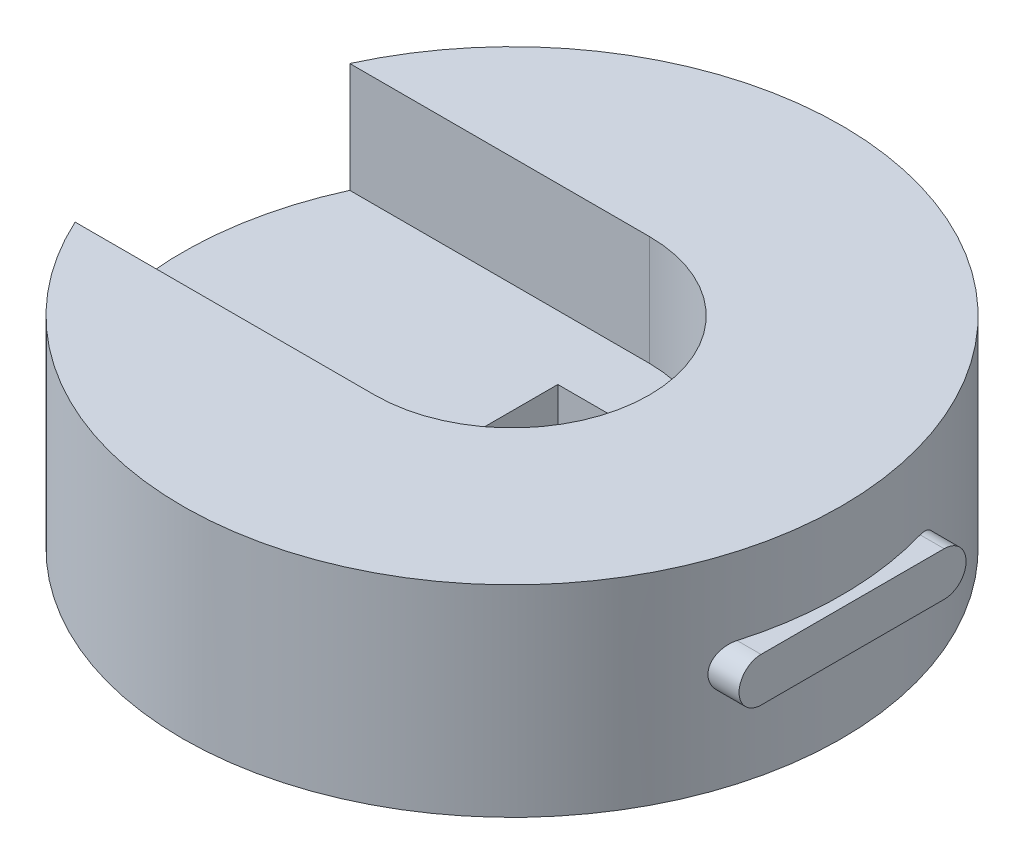
ISO-10303-21;
HEADER;
FILE_DESCRIPTION(('STEP AP214'),'2;1');
FILE_NAME('part.step','',(''),(''),'','','');
FILE_SCHEMA(('AUTOMOTIVE_DESIGN { 1 0 10303 214 1 1 1 1 }'));
ENDSEC;
DATA;
#1=APPLICATION_CONTEXT('core data for automotive mechanical design processes');
#2=APPLICATION_PROTOCOL_DEFINITION('international standard','automotive_design',2000,#1);
#3=PRODUCT_CONTEXT('',#1,'mechanical');
#4=PRODUCT('Part','Part','',(#3));
#5=PRODUCT_RELATED_PRODUCT_CATEGORY('part','',(#4));
#6=PRODUCT_DEFINITION_FORMATION('','',#4);
#7=PRODUCT_DEFINITION_CONTEXT('part definition',#1,'design');
#8=PRODUCT_DEFINITION('design','',#6,#7);
#9=PRODUCT_DEFINITION_SHAPE('','',#8);
#10=(LENGTH_UNIT() NAMED_UNIT(*) SI_UNIT(.MILLI.,.METRE.));
#11=(NAMED_UNIT(*) PLANE_ANGLE_UNIT() SI_UNIT($,.RADIAN.));
#12=(NAMED_UNIT(*) SI_UNIT($,.STERADIAN.) SOLID_ANGLE_UNIT());
#13=UNCERTAINTY_MEASURE_WITH_UNIT(LENGTH_MEASURE(1.E-05),#10,'distance_accuracy_value','');
#14=(GEOMETRIC_REPRESENTATION_CONTEXT(3) GLOBAL_UNCERTAINTY_ASSIGNED_CONTEXT((#13)) GLOBAL_UNIT_ASSIGNED_CONTEXT((#10,
#11,#12)) REPRESENTATION_CONTEXT('',''));
#15=CARTESIAN_POINT('',(0.,0.,0.));
#16=DIRECTION('',(0.,0.,1.));
#17=DIRECTION('',(1.,0.,0.));
#18=AXIS2_PLACEMENT_3D('',#15,#16,#17);
#19=CARTESIAN_POINT('',(0.,55.,0.));
#20=DIRECTION('',(0.,-1.,0.));
#21=DIRECTION('',(0.,0.,-1.));
#22=AXIS2_PLACEMENT_3D('',#19,#20,#21);
#23=CYLINDRICAL_SURFACE('',#22,90.);
#24=CARTESIAN_POINT('',(0.,0.,0.));
#25=DIRECTION('',(0.,1.,0.));
#26=DIRECTION('',(0.,0.,1.));
#27=AXIS2_PLACEMENT_3D('',#24,#25,#26);
#28=CIRCLE('',#27,90.);
#29=CARTESIAN_POINT('',(0.,0.,90.));
#30=VERTEX_POINT('',#29);
#31=EDGE_CURVE('E227',#30,#30,#28,.T.);
#32=ORIENTED_EDGE('',*,*,#31,.T.);
#33=EDGE_LOOP('',(#32));
#34=FACE_BOUND('',#33,.T.);
#35=CARTESIAN_POINT('',(0.,25.,0.));
#36=DIRECTION('',(0.,1.,0.));
#37=DIRECTION('',(0.,0.,1.));
#38=AXIS2_PLACEMENT_3D('',#35,#36,#37);
#39=CIRCLE('',#38,90.);
#40=CARTESIAN_POINT('',(-81.8153408597679,25.,-37.5));
#41=VERTEX_POINT('',#40);
#42=CARTESIAN_POINT('',(-81.8153408597679,25.,37.5));
#43=VERTEX_POINT('',#42);
#44=EDGE_CURVE('E235',#41,#43,#39,.T.);
#45=ORIENTED_EDGE('',*,*,#44,.F.);
#46=DIRECTION('',(0.,-1.,0.));
#47=VECTOR('',#46,1.);
#48=CARTESIAN_POINT('',(-81.8153408597679,55.,-37.5));
#49=LINE('',#48,#47);
#50=CARTESIAN_POINT('',(-81.8153408597679,55.,-37.5));
#51=VERTEX_POINT('',#50);
#52=EDGE_CURVE('E224',#41,#51,#49,.F.);
#53=ORIENTED_EDGE('',*,*,#52,.T.);
#54=CARTESIAN_POINT('',(0.,55.,0.));
#55=DIRECTION('',(0.,1.,0.));
#56=DIRECTION('',(0.,0.,1.));
#57=AXIS2_PLACEMENT_3D('',#54,#55,#56);
#58=CIRCLE('',#57,90.);
#59=CARTESIAN_POINT('',(-81.8153408597679,55.,37.5));
#60=VERTEX_POINT('',#59);
#61=EDGE_CURVE('E228',#60,#51,#58,.T.);
#62=ORIENTED_EDGE('',*,*,#61,.F.);
#63=DIRECTION('',(0.,-1.,0.));
#64=VECTOR('',#63,1.);
#65=CARTESIAN_POINT('',(-81.8153408597679,55.,37.5));
#66=LINE('',#65,#64);
#67=EDGE_CURVE('E219',#60,#43,#66,.T.);
#68=ORIENTED_EDGE('',*,*,#67,.T.);
#69=EDGE_LOOP('',(#45,#53,#62,#68));
#70=FACE_BOUND('',#69,.T.);
#71=CARTESIAN_POINT('',(84.4936888374006,27.920844977807,30.9970409337492));
#72=CARTESIAN_POINT('',(84.4936881424236,27.7595321566228,30.997042424593));
#73=CARTESIAN_POINT('',(84.4960789077135,27.5982394717825,30.990528150367));
#74=CARTESIAN_POINT('',(84.5056074251636,27.2767898667361,30.9645363452115));
#75=CARTESIAN_POINT('',(84.5127464567855,27.1166332644164,30.9450553202777));
#76=CARTESIAN_POINT('',(84.5316809137933,26.7985415261515,30.8932950373056));
#77=CARTESIAN_POINT('',(84.5434804123276,26.6406084589095,30.8610045839935));
#78=CARTESIAN_POINT('',(84.5715771635561,26.3281695900462,30.7839246568537));
#79=CARTESIAN_POINT('',(84.587876122609,26.1736651127347,30.7391304410735));
#80=CARTESIAN_POINT('',(84.6247075891661,25.8695662987199,30.6375875684278));
#81=CARTESIAN_POINT('',(84.6452301141676,25.7199613311639,30.5808670928401));
#82=CARTESIAN_POINT('',(84.690276248355,25.4262105573962,30.4558946573537));
#83=CARTESIAN_POINT('',(84.7148013347413,25.2820667910085,30.3876384396986));
#84=CARTESIAN_POINT('',(84.76753287702,25.0002689272316,30.2402296586008));
#85=CARTESIAN_POINT('',(84.7957374079603,24.8626114873356,30.161082791574));
#86=CARTESIAN_POINT('',(84.8555204239438,24.5944696247351,29.9924766713173));
#87=CARTESIAN_POINT('',(84.8871001868316,24.4639879472523,29.9030135113766));
#88=CARTESIAN_POINT('',(84.9542275474404,24.2073604370261,29.7117782844163));
#89=CARTESIAN_POINT('',(84.9898626783813,24.0814447065546,29.6097277454285));
#90=CARTESIAN_POINT('',(85.0639431195945,23.8387105424476,29.3962307134208));
#91=CARTESIAN_POINT('',(85.1023894499013,23.7218954430198,29.2847808075983));
#92=CARTESIAN_POINT('',(85.2213476080713,23.3861202975684,28.9375460831227));
#93=CARTESIAN_POINT('',(85.3055294181435,23.1816384988439,28.6887324508929));
#94=CARTESIAN_POINT('',(85.4853164839053,22.8056799190263,28.1486424797082));
#95=CARTESIAN_POINT('',(85.5812974811083,22.6366933107123,27.8557683424992));
#96=CARTESIAN_POINT('',(85.7770982847613,22.3504523025249,27.2468649932208));
#97=CARTESIAN_POINT('',(85.8769189931699,22.2332101392404,26.9308303247025));
#98=CARTESIAN_POINT('',(86.0810848695186,22.0496809019785,26.2710970132447));
#99=CARTESIAN_POINT('',(86.1854543028129,21.9855660378699,25.9267998352406));
#100=CARTESIAN_POINT('',(86.391568226238,21.9181027586716,25.2314966083225));
#101=CARTESIAN_POINT('',(86.4933125441087,21.9147583212625,24.8804901217613));
#102=CARTESIAN_POINT('',(86.6917916024304,21.9697122878373,24.1798778450227));
#103=CARTESIAN_POINT('',(86.7884977971193,22.0283287290577,23.830288617703));
#104=CARTESIAN_POINT('',(86.9737905922999,22.2069648041048,23.1448870996679));
#105=CARTESIAN_POINT('',(87.0623780915996,22.3269776311273,22.8090732861773));
#106=CARTESIAN_POINT('',(87.2274013806671,22.6223559042148,22.1695085614334));
#107=CARTESIAN_POINT('',(87.3040724754846,22.7963644782543,21.8651923556667));
#108=CARTESIAN_POINT('',(87.4461641438947,23.1962596314542,21.2898166412541));
#109=CARTESIAN_POINT('',(87.5115868125453,23.4221365316163,21.0187509422879));
#110=CARTESIAN_POINT('',(87.6281305936377,23.9113271073308,20.5273613355225));
#111=CARTESIAN_POINT('',(87.6796519510628,24.1731618056236,20.3056596564914));
#112=CARTESIAN_POINT('',(87.7704871837005,24.7322199350791,19.9093708387509));
#113=CARTESIAN_POINT('',(87.8098029905419,25.0294377562606,19.7347762455306));
#114=CARTESIAN_POINT('',(87.8749380928915,25.6421199797018,19.4426631933344));
#115=CARTESIAN_POINT('',(87.9010929574874,25.9568755815819,19.3237316934144));
#116=CARTESIAN_POINT('',(87.9412763589122,26.602549530093,19.1400324670744));
#117=CARTESIAN_POINT('',(87.9553060911713,26.9334662799789,19.0752594011346));
#118=CARTESIAN_POINT('',(87.9710347267168,27.5966031838741,19.0025898864508));
#119=CARTESIAN_POINT('',(87.9729199199429,27.9287250531896,18.993834179485));
#120=CARTESIAN_POINT('',(87.9648458547614,28.5897135721175,19.0311914538052));
#121=CARTESIAN_POINT('',(87.9548870942236,28.9185803579738,19.0773021287404));
#122=CARTESIAN_POINT('',(87.9232445741436,29.5623902693515,19.2226038957713));
#123=CARTESIAN_POINT('',(87.9016075443399,29.877383512078,19.3215834207831));
#124=CARTESIAN_POINT('',(87.8467837472389,30.4860474231013,19.5693275815515));
#125=CARTESIAN_POINT('',(87.813596876973,30.7797179012739,19.7180926611543));
#126=CARTESIAN_POINT('',(87.735692968886,31.3396469882693,20.0618876611278));
#127=CARTESIAN_POINT('',(87.6908998117291,31.605707744866,20.2572223034692));
#128=CARTESIAN_POINT('',(87.5903761802518,32.1011478671347,20.6875488732266));
#129=CARTESIAN_POINT('',(87.5346449858582,32.3305248160321,20.9225434113911));
#130=CARTESIAN_POINT('',(87.4119167720311,32.7506290055154,21.4295586399996));
#131=CARTESIAN_POINT('',(87.3447368456103,32.9405954381751,21.7021640427162));
#132=CARTESIAN_POINT('',(87.2008712402887,33.2722803205098,22.2731778876004));
#133=CARTESIAN_POINT('',(87.124184370874,33.4139927191962,22.571589559959));
#134=CARTESIAN_POINT('',(87.0020824766936,33.5897424030568,23.0361562930428));
#135=CARTESIAN_POINT('',(86.9595580246394,33.6426548500053,23.1961935608908));
#136=CARTESIAN_POINT('',(86.8726283662795,33.7347354348725,23.5196600072679));
#137=CARTESIAN_POINT('',(86.8282237636076,33.7739079471409,23.6830880886898));
#138=CARTESIAN_POINT('',(86.7377629223392,33.8383672885211,24.0122813486444));
#139=CARTESIAN_POINT('',(86.6917059113791,33.8636475316466,24.1780475975172));
#140=CARTESIAN_POINT('',(86.5982472822948,33.9002302505334,24.5106792511163));
#141=CARTESIAN_POINT('',(86.5508461085486,33.9115372919519,24.6775442788983));
#142=CARTESIAN_POINT('',(86.4534219257235,33.920339304515,25.0167539210096));
#143=CARTESIAN_POINT('',(86.4033637655607,33.9173737236003,25.1891004751637));
#144=CARTESIAN_POINT('',(86.302478304608,33.896664830867,25.5326119844518));
#145=CARTESIAN_POINT('',(86.2516512620505,33.8789263769457,25.7037773093665));
#146=CARTESIAN_POINT('',(86.1495557033866,33.8288313961305,26.0439167152924));
#147=CARTESIAN_POINT('',(86.098286979569,33.7964675765497,26.2128896598181));
#148=CARTESIAN_POINT('',(85.9957439173726,33.7173683271077,26.5473655484759));
#149=CARTESIAN_POINT('',(85.9444695874333,33.6706379981262,26.7128697019716));
#150=CARTESIAN_POINT('',(85.8411943202397,33.5619256833007,27.0429270986575));
#151=CARTESIAN_POINT('',(85.7892019206462,33.4996333311396,27.2073809032161));
#152=CARTESIAN_POINT('',(85.6861037688453,33.3607623140771,27.5303532360127));
#153=CARTESIAN_POINT('',(85.6349976970804,33.2841889202499,27.6888739283015));
#154=CARTESIAN_POINT('',(85.5341128049979,33.1171633022435,27.9989668446863));
#155=CARTESIAN_POINT('',(85.4843345526968,33.0267052467787,28.1505361144223));
#156=CARTESIAN_POINT('',(85.3866488074958,32.8325095387744,28.4454623794897));
#157=CARTESIAN_POINT('',(85.3387405531351,32.7287773666354,28.5888227288266));
#158=CARTESIAN_POINT('',(85.2456526072982,32.5094830303802,28.8652007274153));
#159=CARTESIAN_POINT('',(85.2004545946597,32.3940191332198,28.9982901358573));
#160=CARTESIAN_POINT('',(85.1129180579539,32.1513512993236,29.2542213610126));
#161=CARTESIAN_POINT('',(85.070578391885,32.0241520998685,29.3770672750004));
#162=CARTESIAN_POINT('',(84.9892434434781,31.758743989807,29.6115502484595));
#163=CARTESIAN_POINT('',(84.9502491475311,31.6205318550198,29.7231840036421));
#164=CARTESIAN_POINT('',(84.8761317924061,31.3340647235035,29.9341737726111));
#165=CARTESIAN_POINT('',(84.8410084858445,31.1858103695218,30.0335305710311));
#166=CARTESIAN_POINT('',(84.7765553184866,30.8869512530778,30.2149720400923));
#167=CARTESIAN_POINT('',(84.7470401489304,30.7367279110807,30.297619271329));
#168=CARTESIAN_POINT('',(84.692406681201,30.4291119094277,30.4500050271356));
#169=CARTESIAN_POINT('',(84.6672880325461,30.2717198225113,30.5197445807049));
#170=CARTESIAN_POINT('',(84.6218427724895,29.9511523054969,30.6455249050695));
#171=CARTESIAN_POINT('',(84.6015091180507,29.7879857872369,30.7015858140131));
#172=CARTESIAN_POINT('',(84.5659006141775,29.4569805818044,30.7995319359595));
#173=CARTESIAN_POINT('',(84.5506239947134,29.2891435517185,30.8414221090213));
#174=CARTESIAN_POINT('',(84.5233340387093,28.9228725266971,30.9161422557061));
#175=CARTESIAN_POINT('',(84.5122368458254,28.7238479878853,30.9464421153079));
#176=CARTESIAN_POINT('',(84.4974147934421,28.3234867911413,30.9868902107625));
#177=CARTESIAN_POINT('',(84.4936897046752,28.1221502053082,30.9970390732978));
#178=CARTESIAN_POINT('',(84.4936888374006,27.920844977807,30.9970409337492));
#179=B_SPLINE_CURVE_WITH_KNOTS('',3,(#71,#72,#73,#74,#75,#76,#77,#78,#79,#80,#81,#82,#83,#84,
#85,#86,#87,#88,#89,#90,#91,#92,#93,#94,#95,#96,#97,#98,#99,#100,#101,#102,#103,#104,#105,#106,
#107,#108,#109,#110,#111,#112,#113,#114,#115,#116,#117,#118,#119,#120,#121,#122,#123,#124,#125,
#126,#127,#128,#129,#130,#131,#132,#133,#134,#135,#136,#137,#138,#139,#140,#141,#142,#143,#144,
#145,#146,#147,#148,#149,#150,#151,#152,#153,#154,#155,#156,#157,#158,#159,#160,#161,#162,#163,
#164,#165,#166,#167,#168,#169,#170,#171,#172,#173,#174,#175,#176,#177,#178),.UNSPECIFIED.,.T.,
.F.,(4,2,2,2,2,2,2,2,2,2,2,2,2,2,2,2,2,2,2,2,2,2,2,2,2,2,2,2,2,2,2,2,2,2,2,2,2,2,2,2,2,2,2,2,2,
2,2,2,2,2,2,2,2,4),(0.,0.483755046793423,0.967640498410447,1.45194979466571,1.93644301149584,
2.41980400343523,2.90334379150209,3.38663161600419,3.87010306314834,4.36737589570313,
4.86483006612829,5.85901141809894,6.90887825064133,7.95899322410503,9.05017860704806,
10.1414354124167,11.2383208227565,12.3350846515646,13.4062578534235,14.4772313289557,
15.5129121266728,16.5484289357263,17.5560027683374,18.5634772517861,19.5554601266868,
20.5474013042944,21.5354024138058,22.5234123317392,23.5180737348951,24.5128006406048,
25.5252372404767,26.5378007517718,27.058830982119,27.5796951824481,28.1008060992404,
28.6217467012021,29.1596077278379,29.6972919545753,30.2352445846407,30.7730064328947,
31.3224950837276,31.8717813204829,32.4212988810962,32.970590293474,33.515610225817,
34.0604111004358,34.6053720628221,35.1502981781311,35.6715685294557,36.1927973072229,
36.7132540209687,37.2335283748401,37.8372339433392,38.4409207367057),.UNSPECIFIED.);
#180=CARTESIAN_POINT('',(86.4580823289529,33.9178859115562,25.));
#181=VERTEX_POINT('',#180);
#182=CARTESIAN_POINT('',(86.4580823289529,21.9238040440579,25.));
#183=VERTEX_POINT('',#182);
#184=EDGE_CURVE('E12',#181,#183,#179,.T.);
#185=ORIENTED_EDGE('',*,*,#184,.F.);
#186=CARTESIAN_POINT('',(0.,33.9178859115562,0.));
#187=DIRECTION('',(0.,-1.,0.));
#188=DIRECTION('',(0.,0.,-1.));
#189=AXIS2_PLACEMENT_3D('',#186,#187,#188);
#190=CIRCLE('',#189,90.);
#191=CARTESIAN_POINT('',(86.4580823289529,33.9178859115562,-25.));
#192=VERTEX_POINT('',#191);
#193=EDGE_CURVE('E237',#192,#181,#190,.T.);
#194=ORIENTED_EDGE('',*,*,#193,.F.);
#195=CARTESIAN_POINT('',(87.9709471742029,27.920844977807,-19.0029590662509));
#196=CARTESIAN_POINT('',(87.9709473171616,27.7554213502532,-19.0029577049029));
#197=CARTESIAN_POINT('',(87.9694687255625,27.5900183356423,-19.0098069781072));
#198=CARTESIAN_POINT('',(87.9635559148134,27.2603428641632,-19.0371487594419));
#199=CARTESIAN_POINT('',(87.9591209263098,27.096070712829,-19.0576448189217));
#200=CARTESIAN_POINT('',(87.9472954643351,26.7697471661893,-19.1121426129698));
#201=CARTESIAN_POINT('',(87.9399024373494,26.607697815038,-19.1461560161584));
#202=CARTESIAN_POINT('',(87.9221688347065,26.2870560486114,-19.2274271877194));
#203=CARTESIAN_POINT('',(87.9118271745925,26.1284649283577,-19.274689828827));
#204=CARTESIAN_POINT('',(87.8882288686284,25.816110949248,-19.3820081058385));
#205=CARTESIAN_POINT('',(87.8749757411725,25.6623425164999,-19.4420482978591));
#206=CARTESIAN_POINT('',(87.8455666720555,25.3604502963985,-19.5744991404068));
#207=CARTESIAN_POINT('',(87.8294096641704,25.2123286066671,-19.6469143342079));
#208=CARTESIAN_POINT('',(87.7942409224265,24.9228956270012,-19.8034767243037));
#209=CARTESIAN_POINT('',(87.7752309362567,24.7815802371607,-19.8876167359222));
#210=CARTESIAN_POINT('',(87.7343865857253,24.5065634620269,-20.0670345238309));
#211=CARTESIAN_POINT('',(87.7125511726608,24.3728649305253,-20.1623164343463));
#212=CARTESIAN_POINT('',(87.66594706573,24.1130566355552,-20.3640004001537));
#213=CARTESIAN_POINT('',(87.6411577977407,23.9870105833825,-20.4704797632942));
#214=CARTESIAN_POINT('',(87.5888425723637,23.7443705398799,-20.6931810347258));
#215=CARTESIAN_POINT('',(87.5613156167575,23.6277800245756,-20.8094064942077));
#216=CARTESIAN_POINT('',(87.5036318540475,23.4048641277244,-21.050648058659));
#217=CARTESIAN_POINT('',(87.4734757738119,23.2985359259993,-21.1756617321308));
#218=CARTESIAN_POINT('',(87.4106263956904,23.0967118832293,-21.4336190453324));
#219=CARTESIAN_POINT('',(87.3779321517969,23.0012201140286,-21.5665656374542));
#220=CARTESIAN_POINT('',(87.3094247847416,22.819760652017,-21.8422737200931));
#221=CARTESIAN_POINT('',(87.2735603524619,22.7340368723396,-21.9851832525168));
#222=CARTESIAN_POINT('',(87.1994849731229,22.5749668353921,-22.2771760933702));
#223=CARTESIAN_POINT('',(87.1612731551025,22.5016252106238,-22.4262616865686));
#224=CARTESIAN_POINT('',(87.0434041241263,22.3008561153209,-22.8810720926354));
#225=CARTESIAN_POINT('',(86.960451175049,22.1925197824128,-23.1946020634339));
#226=CARTESIAN_POINT('',(86.784911560591,22.0266437704688,-23.8431383251133));
#227=CARTESIAN_POINT('',(86.6921080757283,21.9707561552085,-24.1785080634547));
#228=CARTESIAN_POINT('',(86.5491065799133,21.9297602395526,-24.683660574111));
#229=CARTESIAN_POINT('',(86.5007773366151,21.9232429260237,-24.8524937130109));
#230=CARTESIAN_POINT('',(86.4031496338098,21.9244397605634,-25.1898087746536));
#231=CARTESIAN_POINT('',(86.3538515073327,21.9321491003696,-25.3582907967987));
#232=CARTESIAN_POINT('',(86.2530788962965,21.9621499203634,-25.6990065016467));
#233=CARTESIAN_POINT('',(86.2015842780357,21.984885361721,-25.871194895296));
#234=CARTESIAN_POINT('',(86.0983178425036,22.045161316552,-26.2128115679143));
#235=CARTESIAN_POINT('',(86.0465461250198,22.0826968132797,-26.3822407619202));
#236=CARTESIAN_POINT('',(85.9430924143885,22.1723339407939,-26.7173283050506));
#237=CARTESIAN_POINT('',(85.8914104790848,22.2244428492252,-26.8829847253208));
#238=CARTESIAN_POINT('',(85.7886133820729,22.342866906742,-27.2092458354056));
#239=CARTESIAN_POINT('',(85.7374980173178,22.4091767811703,-27.3698523755624));
#240=CARTESIAN_POINT('',(85.6355625521514,22.5566372568278,-27.687155501401));
#241=CARTESIAN_POINT('',(85.5847564105533,22.6379811705935,-27.8437668121729));
#242=CARTESIAN_POINT('',(85.4846814464159,22.8143588586624,-28.1495134212817));
#243=CARTESIAN_POINT('',(85.4354120353996,22.9093873123071,-28.2986515949949));
#244=CARTESIAN_POINT('',(85.3388782657479,23.1126336698886,-28.5884451156253));
#245=CARTESIAN_POINT('',(85.2916147231049,23.2208568734484,-28.7290970199336));
#246=CARTESIAN_POINT('',(85.1996560462961,23.4497577634383,-29.0006751209361));
#247=CARTESIAN_POINT('',(85.1549598076498,23.5704300307249,-29.1316055071306));
#248=CARTESIAN_POINT('',(85.0695152393431,23.8209547721477,-29.380171956094));
#249=CARTESIAN_POINT('',(85.0287054737648,23.9505730519696,-29.4980228629226));
#250=CARTESIAN_POINT('',(84.9505550897128,24.2201997029248,-29.7223366285078));
#251=CARTESIAN_POINT('',(84.9132130204934,24.360203684596,-29.8288042524223));
#252=CARTESIAN_POINT('',(84.8424703502575,24.6497033772312,-30.0294279591511));
#253=CARTESIAN_POINT('',(84.8090695480034,24.7991986029807,-30.1235846705762));
#254=CARTESIAN_POINT('',(84.7466764314343,25.1066188587815,-30.2986712071819));
#255=CARTESIAN_POINT('',(84.7176838894891,25.2645434529946,-30.3796017153425));
#256=CARTESIAN_POINT('',(84.6659308168102,25.5791598482977,-30.5235269861506));
#257=CARTESIAN_POINT('',(84.6429234504208,25.7354831767266,-30.5872390251716));
#258=CARTESIAN_POINT('',(84.6015799494049,26.053493823188,-30.7014064889492));
#259=CARTESIAN_POINT('',(84.5832435255855,26.2151808084384,-30.7518627344207));
#260=CARTESIAN_POINT('',(84.551516468408,26.5426533992405,-30.8389885532717));
#261=CARTESIAN_POINT('',(84.5381243930019,26.7084377946842,-30.8756621464986));
#262=CARTESIAN_POINT('',(84.5164838745364,27.0428453951438,-30.9348500946392));
#263=CARTESIAN_POINT('',(84.5082352392954,27.2114684938516,-30.9573649785848));
#264=CARTESIAN_POINT('',(84.4973061968568,27.5412471936995,-30.987182521607));
#265=CARTESIAN_POINT('',(84.4943549644929,27.7023273834971,-30.9952251226036));
#266=CARTESIAN_POINT('',(84.4932238335453,28.0246851874477,-30.9983085077877));
#267=CARTESIAN_POINT('',(84.4950455201582,28.1859628494057,-30.9933449723369));
#268=CARTESIAN_POINT('',(84.5034357641916,28.5073915501854,-30.9704615926406));
#269=CARTESIAN_POINT('',(84.5100020232992,28.6675430965944,-30.9525480215049));
#270=CARTESIAN_POINT('',(84.5277893726936,28.9856924609016,-30.9039397543902));
#271=CARTESIAN_POINT('',(84.5390121896041,29.1436894574371,-30.8732403174731));
#272=CARTESIAN_POINT('',(84.5657403480518,29.4538277720127,-30.7999521545553));
#273=CARTESIAN_POINT('',(84.5811739759091,29.606022388096,-30.7575624042977));
#274=CARTESIAN_POINT('',(84.6162022001121,29.9062164248875,-30.6610658378926));
#275=CARTESIAN_POINT('',(84.6357982840816,30.0542143242357,-30.6069548325384));
#276=CARTESIAN_POINT('',(84.6788960336934,30.3449673725628,-30.4875153610087));
#277=CARTESIAN_POINT('',(84.7023965448377,30.4877240561237,-30.4221902105485));
#278=CARTESIAN_POINT('',(84.7530351510193,30.7672234351908,-30.2808300501559));
#279=CARTESIAN_POINT('',(84.780174617828,30.9039638368049,-30.2047910008701));
#280=CARTESIAN_POINT('',(84.8386364722139,31.1745668714411,-30.0401999178861));
#281=CARTESIAN_POINT('',(84.8700595387294,31.3082217615865,-29.9513421221501));
#282=CARTESIAN_POINT('',(84.9360834270774,31.5675268384423,-29.7635958002596));
#283=CARTESIAN_POINT('',(84.9706854087693,31.6931740749327,-29.6647036115695));
#284=CARTESIAN_POINT('',(85.0426813372741,31.9357033905963,-29.4576705602709));
#285=CARTESIAN_POINT('',(85.080074812532,32.0525869435245,-29.3495312592905));
#286=CARTESIAN_POINT('',(85.1572956575386,32.277042592971,-29.1247168798941));
#287=CARTESIAN_POINT('',(85.1971239395307,32.3846111625365,-29.0080385989307));
#288=CARTESIAN_POINT('',(85.281055634699,32.5954443398936,-28.7603812667974));
#289=CARTESIAN_POINT('',(85.3252737492546,32.6981566073492,-28.6289695597488));
#290=CARTESIAN_POINT('',(85.4155514442783,32.8920409667703,-28.3584905722184));
#291=CARTESIAN_POINT('',(85.461611669676,32.9832089696759,-28.2194206040148));
#292=CARTESIAN_POINT('',(85.6019385592734,33.2386341539236,-27.7920397925397));
#293=CARTESIAN_POINT('',(85.6984169032377,33.3849754265609,-27.4933658902189));
#294=CARTESIAN_POINT('',(85.847120603247,33.5686555491053,-27.0240782250407));
#295=CARTESIAN_POINT('',(85.898547798126,33.6247202806997,-26.8601897162528));
#296=CARTESIAN_POINT('',(86.0016412992161,33.7224687230444,-26.5282452519832));
#297=CARTESIAN_POINT('',(86.0533075275025,33.7641568260154,-26.3601905861575));
#298=CARTESIAN_POINT('',(86.1564829753157,33.8328714915229,-26.0209897652777));
#299=CARTESIAN_POINT('',(86.2079921097903,33.8598911650105,-25.8498421965589));
#300=CARTESIAN_POINT('',(86.3104239750982,33.8990295569155,-25.5057428120112));
#301=CARTESIAN_POINT('',(86.3613469154556,33.9111537743032,-25.3327916857976));
#302=CARTESIAN_POINT('',(86.4630692020572,33.920449340459,-24.9834204339062));
#303=CARTESIAN_POINT('',(86.5138533338325,33.91737658902,-24.806989317638));
#304=CARTESIAN_POINT('',(86.6140724654896,33.8956544025603,-24.4547738301554));
#305=CARTESIAN_POINT('',(86.6635079686824,33.8770108630406,-24.2789892394473));
#306=CARTESIAN_POINT('',(86.7607311592,33.824171252384,-23.9292391341667));
#307=CARTESIAN_POINT('',(86.8085182492712,33.7899696066002,-23.7552742945078));
#308=CARTESIAN_POINT('',(86.9020969210123,33.7061564274739,-23.4106262817232));
#309=CARTESIAN_POINT('',(86.9478893206735,33.656551280014,-23.2399417797379));
#310=CARTESIAN_POINT('',(87.0364959887387,33.5430897129521,-22.9058454198009));
#311=CARTESIAN_POINT('',(87.0793464006219,33.4794762874734,-22.7423606383414));
#312=CARTESIAN_POINT('',(87.1626048345764,33.3379296946926,-22.4211470836525));
#313=CARTESIAN_POINT('',(87.2030138648596,33.2600024929823,-22.2634159451657));
#314=CARTESIAN_POINT('',(87.281204088101,33.0902504781036,-21.9548798772414));
#315=CARTESIAN_POINT('',(87.3189846535899,32.9984223629994,-21.8040766045288));
#316=CARTESIAN_POINT('',(87.3917057711227,32.8015066737648,-21.5107551661605));
#317=CARTESIAN_POINT('',(87.4266475274316,32.6964247708873,-21.3682334947113));
#318=CARTESIAN_POINT('',(87.4924823497942,32.4772357357118,-21.0970231622419));
#319=CARTESIAN_POINT('',(87.5234689485502,32.3635228926923,-20.9680384250008));
#320=CARTESIAN_POINT('',(87.5825148852729,32.1251127111431,-20.7200225228315));
#321=CARTESIAN_POINT('',(87.6105753851331,32.0004197691404,-20.600987410867));
#322=CARTESIAN_POINT('',(87.663691537236,31.7408353904858,-20.3737774434351));
#323=CARTESIAN_POINT('',(87.6887462248394,31.6059407023653,-20.2656060762158));
#324=CARTESIAN_POINT('',(87.7357596724908,31.3269597580851,-20.061093896364));
#325=CARTESIAN_POINT('',(87.7577185432889,31.1828738310016,-19.9647526605351));
#326=CARTESIAN_POINT('',(87.7978808935205,30.8909186564577,-19.7873732380001));
#327=CARTESIAN_POINT('',(87.8161755722303,30.743284044689,-19.7059693103844));
#328=CARTESIAN_POINT('',(87.8497460628071,30.4414109804947,-19.5557674841032));
#329=CARTESIAN_POINT('',(87.8650219838071,30.2871727670455,-19.4869691297322));
#330=CARTESIAN_POINT('',(87.8925074277974,29.9733878084628,-19.3626235981565));
#331=CARTESIAN_POINT('',(87.9047205341576,29.8138475164987,-19.3070609395727));
#332=CARTESIAN_POINT('',(87.9260777232885,29.49051385196,-19.20956383668));
#333=CARTESIAN_POINT('',(87.9352226616996,29.3267216788865,-19.167625592944));
#334=CARTESIAN_POINT('',(87.9521935030937,28.9577663103195,-19.0896209717713));
#335=CARTESIAN_POINT('',(87.9592253674361,28.7517949336972,-19.05715504823));
#336=CARTESIAN_POINT('',(87.9686020886557,28.3374864527669,-19.0138250647066));
#337=CARTESIAN_POINT('',(87.9709469941867,28.1291493730392,-19.0029607804846));
#338=CARTESIAN_POINT('',(87.9709471742029,27.920844977807,-19.0029590662509));
#339=B_SPLINE_CURVE_WITH_KNOTS('',3,(#195,#196,#197,#198,#199,#200,#201,#202,#203,#204,#205,
#206,#207,#208,#209,#210,#211,#212,#213,#214,#215,#216,#217,#218,#219,#220,#221,#222,#223,#224,
#225,#226,#227,#228,#229,#230,#231,#232,#233,#234,#235,#236,#237,#238,#239,#240,#241,#242,#243,
#244,#245,#246,#247,#248,#249,#250,#251,#252,#253,#254,#255,#256,#257,#258,#259,#260,#261,#262,
#263,#264,#265,#266,#267,#268,#269,#270,#271,#272,#273,#274,#275,#276,#277,#278,#279,#280,#281,
#282,#283,#284,#285,#286,#287,#288,#289,#290,#291,#292,#293,#294,#295,#296,#297,#298,#299,#300,
#301,#302,#303,#304,#305,#306,#307,#308,#309,#310,#311,#312,#313,#314,#315,#316,#317,#318,#319,
#320,#321,#322,#323,#324,#325,#326,#327,#328,#329,#330,#331,#332,#333,#334,#335,#336,#337,#338),
.UNSPECIFIED.,.T.,.F.,(4,2,2,2,2,2,2,2,2,2,2,2,2,2,2,2,2,2,2,2,2,2,2,2,2,2,2,2,2,2,2,2,2,2,2,2,
2,2,2,2,2,2,2,2,2,2,2,2,2,2,2,2,2,2,2,2,2,2,2,2,2,2,2,2,2,2,2,2,2,2,2,4),(0.,0.496087211120739,
0.992303571186767,1.48894921539806,1.98577775351099,2.48200916460992,2.97842315168119,
3.47453427545223,3.97083006994288,4.47081053981193,4.97097398611782,5.47099958919359,
5.97121246160575,6.48199610581717,6.99297042666644,8.01400925532084,9.06622508926228,
9.59294923583755,10.1194953950806,10.6623392301286,11.2049992164401,11.7479306807226,
12.2906608329361,12.8409281769199,13.390982147332,13.9412577772392,14.4912948719745,
15.0302402018822,15.56895903312,16.1076503459375,16.6463138328038,17.1567707723064,
17.6671961000987,18.1774724415315,18.6877297156554,19.1710651099016,19.6545610513424,
20.1378229399548,20.6212641795376,21.0969370104647,21.5727801294164,22.0484827961706,
22.52436529462,23.0144530024405,23.504720239303,23.9949048440217,24.4852742442224,
25.002315778416,25.5195399430943,26.5532159928458,27.0947991336042,27.6362166677721,
28.1778882599573,28.719359822561,29.269556710716,29.8195453745616,30.3697312610305,
30.9196893588867,31.4607691740127,32.0016239913978,32.5426074822137,33.0833602683194,
33.6068818820477,34.1301948181663,34.6536752515994,35.1771369532348,35.6852574565046,
36.1933595870312,36.7008644556936,37.2082276752401,37.8329160631706,38.4575979663728),.UNSPECIFIED.);
#340=CARTESIAN_POINT('',(86.4580823289529,21.9238040440579,-25.));
#341=VERTEX_POINT('',#340);
#342=EDGE_CURVE('E78',#341,#192,#339,.T.);
#343=ORIENTED_EDGE('',*,*,#342,.F.);
#344=CARTESIAN_POINT('',(0.,21.9238040440579,0.));
#345=DIRECTION('',(0.,1.,0.));
#346=DIRECTION('',(0.,0.,1.));
#347=AXIS2_PLACEMENT_3D('',#344,#345,#346);
#348=CIRCLE('',#347,90.);
#349=EDGE_CURVE('E68',#183,#341,#348,.T.);
#350=ORIENTED_EDGE('',*,*,#349,.F.);
#351=EDGE_LOOP('',(#185,#194,#343,#350));
#352=FACE_BOUND('',#351,.T.);
#353=ADVANCED_FACE('F56',(#34,#70,#352),#23,.T.);
#354=CARTESIAN_POINT('',(0.,55.,0.));
#355=DIRECTION('',(0.,1.,0.));
#356=DIRECTION('',(0.,0.,1.));
#357=AXIS2_PLACEMENT_3D('',#354,#355,#356);
#358=PLANE('',#357);
#359=DIRECTION('',(-1.,0.,0.));
#360=VECTOR('',#359,1.);
#361=CARTESIAN_POINT('',(-144.325071800872,55.,-37.5));
#362=LINE('',#361,#360);
#363=CARTESIAN_POINT('',(0.,55.,-37.5));
#364=VERTEX_POINT('',#363);
#365=EDGE_CURVE('E207',#364,#51,#362,.T.);
#366=ORIENTED_EDGE('',*,*,#365,.F.);
#367=CARTESIAN_POINT('',(0.,55.,0.));
#368=DIRECTION('',(0.,1.,0.));
#369=DIRECTION('',(0.,0.,1.));
#370=AXIS2_PLACEMENT_3D('',#367,#368,#369);
#371=CIRCLE('',#370,37.5);
#372=CARTESIAN_POINT('',(0.,55.,37.5));
#373=VERTEX_POINT('',#372);
#374=EDGE_CURVE('E197',#373,#364,#371,.T.);
#375=ORIENTED_EDGE('',*,*,#374,.F.);
#376=DIRECTION('',(1.,0.,0.));
#377=VECTOR('',#376,1.);
#378=CARTESIAN_POINT('',(0.,55.,37.5));
#379=LINE('',#378,#377);
#380=EDGE_CURVE('E231',#60,#373,#379,.T.);
#381=ORIENTED_EDGE('',*,*,#380,.F.);
#382=ORIENTED_EDGE('',*,*,#61,.T.);
#383=EDGE_LOOP('',(#366,#375,#381,#382));
#384=FACE_BOUND('',#383,.T.);
#385=ADVANCED_FACE('F289',(#384),#358,.T.);
#386=CARTESIAN_POINT('',(0.,0.,0.));
#387=DIRECTION('',(0.,1.,0.));
#388=DIRECTION('',(0.,0.,1.));
#389=AXIS2_PLACEMENT_3D('',#386,#387,#388);
#390=PLANE('',#389);
#391=DIRECTION('',(1.,0.,0.));
#392=VECTOR('',#391,1.);
#393=CARTESIAN_POINT('',(-7.5,0.,20.));
#394=LINE('',#393,#392);
#395=CARTESIAN_POINT('',(-7.5,0.,20.));
#396=VERTEX_POINT('',#395);
#397=CARTESIAN_POINT('',(7.5,0.,20.));
#398=VERTEX_POINT('',#397);
#399=EDGE_CURVE('E184',#396,#398,#394,.T.);
#400=ORIENTED_EDGE('',*,*,#399,.T.);
#401=DIRECTION('',(0.,0.,-1.));
#402=VECTOR('',#401,1.);
#403=CARTESIAN_POINT('',(7.5,0.,-20.));
#404=LINE('',#403,#402);
#405=CARTESIAN_POINT('',(7.5,0.,-20.));
#406=VERTEX_POINT('',#405);
#407=EDGE_CURVE('E174',#398,#406,#404,.T.);
#408=ORIENTED_EDGE('',*,*,#407,.T.);
#409=DIRECTION('',(-1.,0.,0.));
#410=VECTOR('',#409,1.);
#411=CARTESIAN_POINT('',(-7.5,0.,-20.));
#412=LINE('',#411,#410);
#413=CARTESIAN_POINT('',(-7.5,0.,-20.));
#414=VERTEX_POINT('',#413);
#415=EDGE_CURVE('E177',#406,#414,#412,.T.);
#416=ORIENTED_EDGE('',*,*,#415,.T.);
#417=DIRECTION('',(0.,0.,1.));
#418=VECTOR('',#417,1.);
#419=CARTESIAN_POINT('',(-7.5,0.,-20.));
#420=LINE('',#419,#418);
#421=EDGE_CURVE('E181',#414,#396,#420,.T.);
#422=ORIENTED_EDGE('',*,*,#421,.T.);
#423=EDGE_LOOP('',(#400,#408,#416,#422));
#424=FACE_BOUND('',#423,.T.);
#425=ORIENTED_EDGE('',*,*,#31,.F.);
#426=EDGE_LOOP('',(#425));
#427=FACE_BOUND('',#426,.T.);
#428=ADVANCED_FACE('F277',(#424,#427),#390,.F.);
#429=CARTESIAN_POINT('',(-144.325071800872,25.,0.));
#430=DIRECTION('',(0.,1.,0.));
#431=DIRECTION('',(0.,0.,1.));
#432=AXIS2_PLACEMENT_3D('',#429,#430,#431);
#433=PLANE('',#432);
#434=DIRECTION('',(0.,0.,-1.));
#435=VECTOR('',#434,1.);
#436=CARTESIAN_POINT('',(7.5,25.,-20.));
#437=LINE('',#436,#435);
#438=CARTESIAN_POINT('',(7.5,25.,20.));
#439=VERTEX_POINT('',#438);
#440=CARTESIAN_POINT('',(7.50000000000001,25.,-20.));
#441=VERTEX_POINT('',#440);
#442=EDGE_CURVE('E166',#439,#441,#437,.T.);
#443=ORIENTED_EDGE('',*,*,#442,.F.);
#444=DIRECTION('',(1.,0.,0.));
#445=VECTOR('',#444,1.);
#446=CARTESIAN_POINT('',(-7.5,25.,20.));
#447=LINE('',#446,#445);
#448=CARTESIAN_POINT('',(-7.5,25.,20.));
#449=VERTEX_POINT('',#448);
#450=EDGE_CURVE('E178',#449,#439,#447,.T.);
#451=ORIENTED_EDGE('',*,*,#450,.F.);
#452=DIRECTION('',(0.,0.,1.));
#453=VECTOR('',#452,1.);
#454=CARTESIAN_POINT('',(-7.5,25.,-20.));
#455=LINE('',#454,#453);
#456=CARTESIAN_POINT('',(-7.5,25.,-20.));
#457=VERTEX_POINT('',#456);
#458=EDGE_CURVE('E190',#457,#449,#455,.T.);
#459=ORIENTED_EDGE('',*,*,#458,.F.);
#460=DIRECTION('',(-1.,0.,0.));
#461=VECTOR('',#460,1.);
#462=CARTESIAN_POINT('',(-7.5,25.,-20.));
#463=LINE('',#462,#461);
#464=EDGE_CURVE('E168',#441,#457,#463,.T.);
#465=ORIENTED_EDGE('',*,*,#464,.F.);
#466=EDGE_LOOP('',(#443,#451,#459,#465));
#467=FACE_BOUND('',#466,.T.);
#468=ORIENTED_EDGE('',*,*,#44,.T.);
#469=DIRECTION('',(1.,0.,0.));
#470=VECTOR('',#469,1.);
#471=CARTESIAN_POINT('',(-144.325071800872,25.,37.5));
#472=LINE('',#471,#470);
#473=CARTESIAN_POINT('',(0.,25.,37.5));
#474=VERTEX_POINT('',#473);
#475=EDGE_CURVE('E204',#43,#474,#472,.T.);
#476=ORIENTED_EDGE('',*,*,#475,.T.);
#477=CARTESIAN_POINT('',(0.,25.,0.));
#478=DIRECTION('',(0.,1.,0.));
#479=DIRECTION('',(0.,0.,1.));
#480=AXIS2_PLACEMENT_3D('',#477,#478,#479);
#481=CIRCLE('',#480,37.5);
#482=CARTESIAN_POINT('',(0.,25.,-37.5));
#483=VERTEX_POINT('',#482);
#484=EDGE_CURVE('E206',#474,#483,#481,.T.);
#485=ORIENTED_EDGE('',*,*,#484,.T.);
#486=DIRECTION('',(-1.,0.,0.));
#487=VECTOR('',#486,1.);
#488=CARTESIAN_POINT('',(-144.325071800872,25.,-37.5));
#489=LINE('',#488,#487);
#490=EDGE_CURVE('E210',#483,#41,#489,.T.);
#491=ORIENTED_EDGE('',*,*,#490,.T.);
#492=EDGE_LOOP('',(#468,#476,#485,#491));
#493=FACE_BOUND('',#492,.T.);
#494=ADVANCED_FACE('F273',(#467,#493),#433,.T.);
#495=CARTESIAN_POINT('',(-144.325071800872,25.,-37.5));
#496=DIRECTION('',(0.,0.,-1.));
#497=DIRECTION('',(-1.,0.,0.));
#498=AXIS2_PLACEMENT_3D('',#495,#496,#497);
#499=PLANE('',#498);
#500=ORIENTED_EDGE('',*,*,#490,.F.);
#501=DIRECTION('',(0.,1.,0.));
#502=VECTOR('',#501,1.);
#503=CARTESIAN_POINT('',(0.,25.,-37.5));
#504=LINE('',#503,#502);
#505=EDGE_CURVE('E217',#483,#364,#504,.T.);
#506=ORIENTED_EDGE('',*,*,#505,.T.);
#507=ORIENTED_EDGE('',*,*,#365,.T.);
#508=ORIENTED_EDGE('',*,*,#52,.F.);
#509=EDGE_LOOP('',(#500,#506,#507,#508));
#510=FACE_BOUND('',#509,.T.);
#511=ADVANCED_FACE('F276',(#510),#499,.F.);
#512=CARTESIAN_POINT('',(-144.325071800872,25.,37.5));
#513=DIRECTION('',(0.,0.,1.));
#514=DIRECTION('',(1.,0.,0.));
#515=AXIS2_PLACEMENT_3D('',#512,#513,#514);
#516=PLANE('',#515);
#517=ORIENTED_EDGE('',*,*,#380,.T.);
#518=DIRECTION('',(0.,1.,0.));
#519=VECTOR('',#518,1.);
#520=CARTESIAN_POINT('',(0.,25.,37.5));
#521=LINE('',#520,#519);
#522=EDGE_CURVE('E213',#474,#373,#521,.T.);
#523=ORIENTED_EDGE('',*,*,#522,.F.);
#524=ORIENTED_EDGE('',*,*,#475,.F.);
#525=ORIENTED_EDGE('',*,*,#67,.F.);
#526=EDGE_LOOP('',(#517,#523,#524,#525));
#527=FACE_BOUND('',#526,.T.);
#528=ADVANCED_FACE('F281',(#527),#516,.F.);
#529=CARTESIAN_POINT('',(0.,25.,0.));
#530=DIRECTION('',(0.,1.,0.));
#531=DIRECTION('',(0.,0.,1.));
#532=AXIS2_PLACEMENT_3D('',#529,#530,#531);
#533=CYLINDRICAL_SURFACE('',#532,37.5);
#534=ORIENTED_EDGE('',*,*,#374,.T.);
#535=ORIENTED_EDGE('',*,*,#505,.F.);
#536=ORIENTED_EDGE('',*,*,#484,.F.);
#537=ORIENTED_EDGE('',*,*,#522,.T.);
#538=EDGE_LOOP('',(#534,#535,#536,#537));
#539=FACE_BOUND('',#538,.T.);
#540=ADVANCED_FACE('F271',(#539),#533,.F.);
#541=CARTESIAN_POINT('',(7.5,0.,-20.));
#542=DIRECTION('',(1.,0.,0.));
#543=DIRECTION('',(0.,0.,-1.));
#544=AXIS2_PLACEMENT_3D('',#541,#542,#543);
#545=PLANE('',#544);
#546=ORIENTED_EDGE('',*,*,#442,.T.);
#547=DIRECTION('',(0.,1.,0.));
#548=VECTOR('',#547,1.);
#549=CARTESIAN_POINT('',(7.5,0.,-20.));
#550=LINE('',#549,#548);
#551=EDGE_CURVE('E186',#406,#441,#550,.T.);
#552=ORIENTED_EDGE('',*,*,#551,.F.);
#553=ORIENTED_EDGE('',*,*,#407,.F.);
#554=DIRECTION('',(0.,1.,0.));
#555=VECTOR('',#554,1.);
#556=CARTESIAN_POINT('',(7.5,0.,20.));
#557=LINE('',#556,#555);
#558=EDGE_CURVE('E195',#398,#439,#557,.T.);
#559=ORIENTED_EDGE('',*,*,#558,.T.);
#560=EDGE_LOOP('',(#546,#552,#553,#559));
#561=FACE_BOUND('',#560,.T.);
#562=ADVANCED_FACE('F261',(#561),#545,.F.);
#563=CARTESIAN_POINT('',(-7.5,0.,20.));
#564=DIRECTION('',(0.,0.,1.));
#565=DIRECTION('',(1.,0.,0.));
#566=AXIS2_PLACEMENT_3D('',#563,#564,#565);
#567=PLANE('',#566);
#568=ORIENTED_EDGE('',*,*,#450,.T.);
#569=ORIENTED_EDGE('',*,*,#558,.F.);
#570=ORIENTED_EDGE('',*,*,#399,.F.);
#571=DIRECTION('',(0.,1.,0.));
#572=VECTOR('',#571,1.);
#573=CARTESIAN_POINT('',(-7.5,0.,20.));
#574=LINE('',#573,#572);
#575=EDGE_CURVE('E198',#396,#449,#574,.T.);
#576=ORIENTED_EDGE('',*,*,#575,.T.);
#577=EDGE_LOOP('',(#568,#569,#570,#576));
#578=FACE_BOUND('',#577,.T.);
#579=ADVANCED_FACE('F257',(#578),#567,.F.);
#580=CARTESIAN_POINT('',(-7.5,0.,-20.));
#581=DIRECTION('',(-1.,0.,0.));
#582=DIRECTION('',(0.,0.,1.));
#583=AXIS2_PLACEMENT_3D('',#580,#581,#582);
#584=PLANE('',#583);
#585=ORIENTED_EDGE('',*,*,#458,.T.);
#586=ORIENTED_EDGE('',*,*,#575,.F.);
#587=ORIENTED_EDGE('',*,*,#421,.F.);
#588=DIRECTION('',(0.,1.,0.));
#589=VECTOR('',#588,1.);
#590=CARTESIAN_POINT('',(-7.5,0.,-20.));
#591=LINE('',#590,#589);
#592=EDGE_CURVE('E200',#414,#457,#591,.T.);
#593=ORIENTED_EDGE('',*,*,#592,.T.);
#594=EDGE_LOOP('',(#585,#586,#587,#593));
#595=FACE_BOUND('',#594,.T.);
#596=ADVANCED_FACE('F260',(#595),#584,.F.);
#597=CARTESIAN_POINT('',(-7.5,0.,-20.));
#598=DIRECTION('',(0.,0.,-1.));
#599=DIRECTION('',(-1.,0.,0.));
#600=AXIS2_PLACEMENT_3D('',#597,#598,#599);
#601=PLANE('',#600);
#602=ORIENTED_EDGE('',*,*,#464,.T.);
#603=ORIENTED_EDGE('',*,*,#592,.F.);
#604=ORIENTED_EDGE('',*,*,#415,.F.);
#605=ORIENTED_EDGE('',*,*,#551,.T.);
#606=EDGE_LOOP('',(#602,#603,#604,#605));
#607=FACE_BOUND('',#606,.T.);
#608=ADVANCED_FACE('F256',(#607),#601,.F.);
#609=CARTESIAN_POINT('',(93.,27.920844977807,25.));
#610=DIRECTION('',(-1.,0.,0.));
#611=DIRECTION('',(0.,0.,1.));
#612=AXIS2_PLACEMENT_3D('',#609,#610,#611);
#613=CYLINDRICAL_SURFACE('',#612,5.99704093374915);
#614=DIRECTION('',(-1.,0.,0.));
#615=VECTOR('',#614,1.);
#616=CARTESIAN_POINT('',(93.,33.9178859115562,25.));
#617=LINE('',#616,#615);
#618=CARTESIAN_POINT('',(93.,33.9178859115562,25.));
#619=VERTEX_POINT('',#618);
#620=EDGE_CURVE('E306',#619,#181,#617,.T.);
#621=ORIENTED_EDGE('',*,*,#620,.T.);
#622=ORIENTED_EDGE('',*,*,#184,.T.);
#623=DIRECTION('',(-1.,0.,0.));
#624=VECTOR('',#623,1.);
#625=CARTESIAN_POINT('',(93.,21.9238040440579,25.));
#626=LINE('',#625,#624);
#627=CARTESIAN_POINT('',(93.,21.9238040440579,25.));
#628=VERTEX_POINT('',#627);
#629=EDGE_CURVE('E149',#628,#183,#626,.T.);
#630=ORIENTED_EDGE('',*,*,#629,.F.);
#631=CARTESIAN_POINT('',(93.,27.920844977807,25.));
#632=DIRECTION('',(1.,0.,0.));
#633=DIRECTION('',(0.,0.,-1.));
#634=AXIS2_PLACEMENT_3D('',#631,#632,#633);
#635=CIRCLE('',#634,5.99704093374915);
#636=EDGE_CURVE('E155',#619,#628,#635,.T.);
#637=ORIENTED_EDGE('',*,*,#636,.F.);
#638=EDGE_LOOP('',(#621,#622,#630,#637));
#639=FACE_BOUND('',#638,.T.);
#640=ADVANCED_FACE('F165',(#639),#613,.T.);
#641=CARTESIAN_POINT('',(93.,27.920844977807,-25.));
#642=DIRECTION('',(-1.,0.,0.));
#643=DIRECTION('',(0.,0.,1.));
#644=AXIS2_PLACEMENT_3D('',#641,#642,#643);
#645=CYLINDRICAL_SURFACE('',#644,5.99704093374915);
#646=DIRECTION('',(-1.,0.,0.));
#647=VECTOR('',#646,1.);
#648=CARTESIAN_POINT('',(93.,21.9238040440579,-25.));
#649=LINE('',#648,#647);
#650=CARTESIAN_POINT('',(93.,21.9238040440579,-25.));
#651=VERTEX_POINT('',#650);
#652=EDGE_CURVE('E151',#651,#341,#649,.T.);
#653=ORIENTED_EDGE('',*,*,#652,.T.);
#654=ORIENTED_EDGE('',*,*,#342,.T.);
#655=DIRECTION('',(-1.,0.,0.));
#656=VECTOR('',#655,1.);
#657=CARTESIAN_POINT('',(93.,33.9178859115562,-25.));
#658=LINE('',#657,#656);
#659=CARTESIAN_POINT('',(93.,33.9178859115562,-25.));
#660=VERTEX_POINT('',#659);
#661=EDGE_CURVE('E170',#660,#192,#658,.T.);
#662=ORIENTED_EDGE('',*,*,#661,.F.);
#663=CARTESIAN_POINT('',(93.,27.920844977807,-25.));
#664=DIRECTION('',(1.,0.,0.));
#665=DIRECTION('',(0.,0.,-1.));
#666=AXIS2_PLACEMENT_3D('',#663,#664,#665);
#667=CIRCLE('',#666,5.99704093374915);
#668=EDGE_CURVE('E154',#651,#660,#667,.T.);
#669=ORIENTED_EDGE('',*,*,#668,.F.);
#670=EDGE_LOOP('',(#653,#654,#662,#669));
#671=FACE_BOUND('',#670,.T.);
#672=ADVANCED_FACE('F244',(#671),#645,.T.);
#673=CARTESIAN_POINT('',(93.,21.9238040440579,25.));
#674=DIRECTION('',(0.,1.,0.));
#675=DIRECTION('',(0.,0.,1.));
#676=AXIS2_PLACEMENT_3D('',#673,#674,#675);
#677=PLANE('',#676);
#678=ORIENTED_EDGE('',*,*,#629,.T.);
#679=ORIENTED_EDGE('',*,*,#349,.T.);
#680=ORIENTED_EDGE('',*,*,#652,.F.);
#681=DIRECTION('',(0.,0.,-1.));
#682=VECTOR('',#681,1.);
#683=CARTESIAN_POINT('',(93.,21.9238040440579,25.));
#684=LINE('',#683,#682);
#685=EDGE_CURVE('E145',#628,#651,#684,.T.);
#686=ORIENTED_EDGE('',*,*,#685,.F.);
#687=EDGE_LOOP('',(#678,#679,#680,#686));
#688=FACE_BOUND('',#687,.T.);
#689=ADVANCED_FACE('F147',(#688),#677,.F.);
#690=CARTESIAN_POINT('',(93.,33.9178859115562,25.));
#691=DIRECTION('',(0.,-1.,0.));
#692=DIRECTION('',(0.,0.,-1.));
#693=AXIS2_PLACEMENT_3D('',#690,#691,#692);
#694=PLANE('',#693);
#695=ORIENTED_EDGE('',*,*,#661,.T.);
#696=ORIENTED_EDGE('',*,*,#193,.T.);
#697=ORIENTED_EDGE('',*,*,#620,.F.);
#698=DIRECTION('',(0.,0.,1.));
#699=VECTOR('',#698,1.);
#700=CARTESIAN_POINT('',(93.,33.9178859115562,25.));
#701=LINE('',#700,#699);
#702=EDGE_CURVE('E160',#660,#619,#701,.T.);
#703=ORIENTED_EDGE('',*,*,#702,.F.);
#704=EDGE_LOOP('',(#695,#696,#697,#703));
#705=FACE_BOUND('',#704,.T.);
#706=ADVANCED_FACE('F250',(#705),#694,.F.);
#707=CARTESIAN_POINT('',(93.,27.920844977807,25.));
#708=DIRECTION('',(1.,0.,0.));
#709=DIRECTION('',(0.,0.,-1.));
#710=AXIS2_PLACEMENT_3D('',#707,#708,#709);
#711=PLANE('',#710);
#712=ORIENTED_EDGE('',*,*,#636,.T.);
#713=ORIENTED_EDGE('',*,*,#685,.T.);
#714=ORIENTED_EDGE('',*,*,#668,.T.);
#715=ORIENTED_EDGE('',*,*,#702,.T.);
#716=EDGE_LOOP('',(#712,#713,#714,#715));
#717=FACE_BOUND('',#716,.T.);
#718=ADVANCED_FACE('F158',(#717),#711,.T.);
#719=CLOSED_SHELL('',(#353,#385,#428,#494,#511,#528,#540,#562,#579,#596,#608,#640,#672,#689,
#706,#718));
#720=MANIFOLD_SOLID_BREP('B2',#719);
#721=ADVANCED_BREP_SHAPE_REPRESENTATION('',(#18,#720),#14);
#722=SHAPE_DEFINITION_REPRESENTATION(#9,#721);
ENDSEC;
END-ISO-10303-21;
